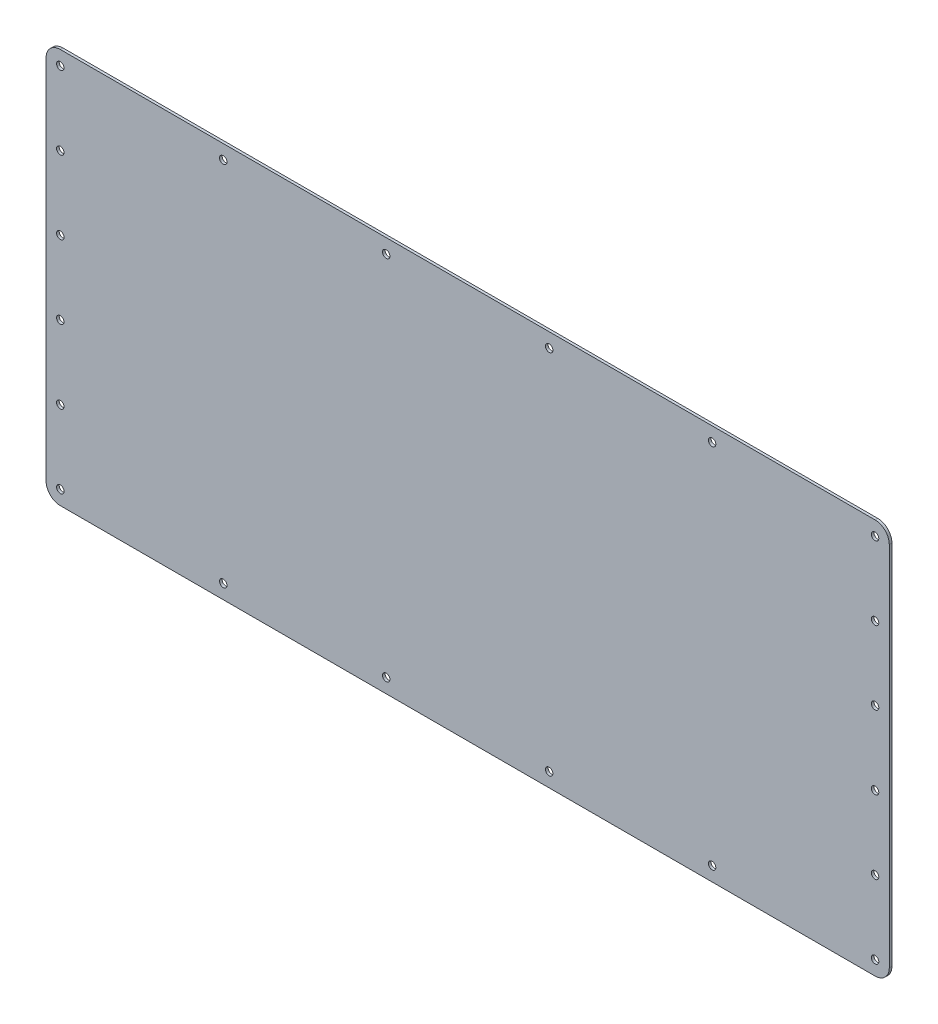
ISO-10303-21;
HEADER;
FILE_DESCRIPTION(('STEP AP214'),'2;1');
FILE_NAME('part.step','',(''),(''),'','','');
FILE_SCHEMA(('AUTOMOTIVE_DESIGN { 1 0 10303 214 1 1 1 1 }'));
ENDSEC;
DATA;
#1=APPLICATION_CONTEXT('core data for automotive mechanical design processes');
#2=APPLICATION_PROTOCOL_DEFINITION('international standard','automotive_design',2000,#1);
#3=PRODUCT_CONTEXT('',#1,'mechanical');
#4=PRODUCT('Part','Part','',(#3));
#5=PRODUCT_RELATED_PRODUCT_CATEGORY('part','',(#4));
#6=PRODUCT_DEFINITION_FORMATION('','',#4);
#7=PRODUCT_DEFINITION_CONTEXT('part definition',#1,'design');
#8=PRODUCT_DEFINITION('design','',#6,#7);
#9=PRODUCT_DEFINITION_SHAPE('','',#8);
#10=(LENGTH_UNIT() NAMED_UNIT(*) SI_UNIT(.MILLI.,.METRE.));
#11=(NAMED_UNIT(*) PLANE_ANGLE_UNIT() SI_UNIT($,.RADIAN.));
#12=(NAMED_UNIT(*) SI_UNIT($,.STERADIAN.) SOLID_ANGLE_UNIT());
#13=UNCERTAINTY_MEASURE_WITH_UNIT(LENGTH_MEASURE(1.E-05),#10,'distance_accuracy_value','');
#14=(GEOMETRIC_REPRESENTATION_CONTEXT(3) GLOBAL_UNCERTAINTY_ASSIGNED_CONTEXT((#13)) GLOBAL_UNIT_ASSIGNED_CONTEXT((#10,
#11,#12)) REPRESENTATION_CONTEXT('',''));
#15=CARTESIAN_POINT('',(0.,0.,0.));
#16=DIRECTION('',(0.,0.,1.));
#17=DIRECTION('',(1.,0.,0.));
#18=AXIS2_PLACEMENT_3D('',#15,#16,#17);
#19=CARTESIAN_POINT('',(282.342840444,132.289198083,1.76784));
#20=DIRECTION('',(-1.,0.,0.));
#21=DIRECTION('',(0.,-1.,0.));
#22=AXIS2_PLACEMENT_3D('',#19,#20,#21);
#23=PLANE('',#22);
#24=DIRECTION('',(0.,1.,0.));
#25=VECTOR('',#24,1.);
#26=CARTESIAN_POINT('',(282.342840444,132.289198083,0.));
#27=LINE('',#26,#25);
#28=CARTESIAN_POINT('',(282.342840444,-122.764198083,0.));
#29=VERTEX_POINT('',#28);
#30=CARTESIAN_POINT('',(282.342840444,122.764198083,0.));
#31=VERTEX_POINT('',#30);
#32=EDGE_CURVE('E128',#29,#31,#27,.T.);
#33=ORIENTED_EDGE('',*,*,#32,.T.);
#34=DIRECTION('',(0.,0.,-1.));
#35=VECTOR('',#34,1.);
#36=CARTESIAN_POINT('',(282.342840444,122.764198083,1.76784));
#37=LINE('',#36,#35);
#38=CARTESIAN_POINT('',(282.342840444,122.764198083,1.76784));
#39=VERTEX_POINT('',#38);
#40=EDGE_CURVE('E151',#31,#39,#37,.F.);
#41=ORIENTED_EDGE('',*,*,#40,.T.);
#42=DIRECTION('',(0.,1.,0.));
#43=VECTOR('',#42,1.);
#44=CARTESIAN_POINT('',(282.342840444,132.289198083,1.76784));
#45=LINE('',#44,#43);
#46=CARTESIAN_POINT('',(282.342840444,-122.764198083,1.76784));
#47=VERTEX_POINT('',#46);
#48=EDGE_CURVE('E126',#47,#39,#45,.T.);
#49=ORIENTED_EDGE('',*,*,#48,.F.);
#50=DIRECTION('',(0.,0.,-1.));
#51=VECTOR('',#50,1.);
#52=CARTESIAN_POINT('',(282.342840444,-122.764198083,1.76784));
#53=LINE('',#52,#51);
#54=EDGE_CURVE('E148',#47,#29,#53,.T.);
#55=ORIENTED_EDGE('',*,*,#54,.T.);
#56=EDGE_LOOP('',(#33,#41,#49,#55));
#57=FACE_BOUND('',#56,.T.);
#58=ADVANCED_FACE('F33',(#57),#23,.F.);
#59=CARTESIAN_POINT('',(-282.342840444,132.289198083,1.76784));
#60=DIRECTION('',(0.,-1.,0.));
#61=DIRECTION('',(0.,0.,-1.));
#62=AXIS2_PLACEMENT_3D('',#59,#60,#61);
#63=PLANE('',#62);
#64=DIRECTION('',(-1.,0.,0.));
#65=VECTOR('',#64,1.);
#66=CARTESIAN_POINT('',(-282.342840444,132.289198083,0.));
#67=LINE('',#66,#65);
#68=CARTESIAN_POINT('',(272.817840444,132.289198083,0.));
#69=VERTEX_POINT('',#68);
#70=CARTESIAN_POINT('',(-272.817840444,132.289198083,0.));
#71=VERTEX_POINT('',#70);
#72=EDGE_CURVE('E124',#69,#71,#67,.T.);
#73=ORIENTED_EDGE('',*,*,#72,.T.);
#74=DIRECTION('',(0.,0.,-1.));
#75=VECTOR('',#74,1.);
#76=CARTESIAN_POINT('',(-272.817840444,132.289198083,1.76784));
#77=LINE('',#76,#75);
#78=CARTESIAN_POINT('',(-272.817840444,132.289198083,1.76784));
#79=VERTEX_POINT('',#78);
#80=EDGE_CURVE('E103',#71,#79,#77,.F.);
#81=ORIENTED_EDGE('',*,*,#80,.T.);
#82=DIRECTION('',(-1.,0.,0.));
#83=VECTOR('',#82,1.);
#84=CARTESIAN_POINT('',(-282.342840444,132.289198083,1.76784));
#85=LINE('',#84,#83);
#86=CARTESIAN_POINT('',(272.817840444,132.289198083,1.76784));
#87=VERTEX_POINT('',#86);
#88=EDGE_CURVE('E167',#87,#79,#85,.T.);
#89=ORIENTED_EDGE('',*,*,#88,.F.);
#90=DIRECTION('',(0.,0.,-1.));
#91=VECTOR('',#90,1.);
#92=CARTESIAN_POINT('',(272.817840444,132.289198083,1.76784));
#93=LINE('',#92,#91);
#94=EDGE_CURVE('E108',#87,#69,#93,.T.);
#95=ORIENTED_EDGE('',*,*,#94,.T.);
#96=EDGE_LOOP('',(#73,#81,#89,#95));
#97=FACE_BOUND('',#96,.T.);
#98=ADVANCED_FACE('F344',(#97),#63,.F.);
#99=CARTESIAN_POINT('',(-282.342840444,132.289198083,1.76784));
#100=DIRECTION('',(1.,0.,0.));
#101=DIRECTION('',(0.,1.,0.));
#102=AXIS2_PLACEMENT_3D('',#99,#100,#101);
#103=PLANE('',#102);
#104=DIRECTION('',(0.,-1.,0.));
#105=VECTOR('',#104,1.);
#106=CARTESIAN_POINT('',(-282.342840444,132.289198083,1.76784));
#107=LINE('',#106,#105);
#108=CARTESIAN_POINT('',(-282.342840444,122.764198083,1.76784));
#109=VERTEX_POINT('',#108);
#110=CARTESIAN_POINT('',(-282.342840444,-122.764198083,1.76784));
#111=VERTEX_POINT('',#110);
#112=EDGE_CURVE('E117',#109,#111,#107,.T.);
#113=ORIENTED_EDGE('',*,*,#112,.F.);
#114=DIRECTION('',(0.,0.,-1.));
#115=VECTOR('',#114,1.);
#116=CARTESIAN_POINT('',(-282.342840444,122.764198083,1.76784));
#117=LINE('',#116,#115);
#118=CARTESIAN_POINT('',(-282.342840444,122.764198083,0.));
#119=VERTEX_POINT('',#118);
#120=EDGE_CURVE('E102',#109,#119,#117,.T.);
#121=ORIENTED_EDGE('',*,*,#120,.T.);
#122=DIRECTION('',(0.,-1.,0.));
#123=VECTOR('',#122,1.);
#124=CARTESIAN_POINT('',(-282.342840444,132.289198083,0.));
#125=LINE('',#124,#123);
#126=CARTESIAN_POINT('',(-282.342840444,-122.764198083,0.));
#127=VERTEX_POINT('',#126);
#128=EDGE_CURVE('E115',#119,#127,#125,.T.);
#129=ORIENTED_EDGE('',*,*,#128,.T.);
#130=DIRECTION('',(0.,0.,-1.));
#131=VECTOR('',#130,1.);
#132=CARTESIAN_POINT('',(-282.342840444,-122.764198083,1.76784));
#133=LINE('',#132,#131);
#134=EDGE_CURVE('E119',#127,#111,#133,.F.);
#135=ORIENTED_EDGE('',*,*,#134,.T.);
#136=EDGE_LOOP('',(#113,#121,#129,#135));
#137=FACE_BOUND('',#136,.T.);
#138=ADVANCED_FACE('F114',(#137),#103,.F.);
#139=CARTESIAN_POINT('',(-282.342840444,-132.289198083,1.76784));
#140=DIRECTION('',(0.,1.,0.));
#141=DIRECTION('',(0.,0.,1.));
#142=AXIS2_PLACEMENT_3D('',#139,#140,#141);
#143=PLANE('',#142);
#144=DIRECTION('',(1.,0.,0.));
#145=VECTOR('',#144,1.);
#146=CARTESIAN_POINT('',(-282.342840444,-132.289198083,0.));
#147=LINE('',#146,#145);
#148=CARTESIAN_POINT('',(-272.817840444,-132.289198083,0.));
#149=VERTEX_POINT('',#148);
#150=CARTESIAN_POINT('',(272.817840444,-132.289198083,0.));
#151=VERTEX_POINT('',#150);
#152=EDGE_CURVE('E123',#149,#151,#147,.T.);
#153=ORIENTED_EDGE('',*,*,#152,.T.);
#154=DIRECTION('',(0.,0.,-1.));
#155=VECTOR('',#154,1.);
#156=CARTESIAN_POINT('',(272.817840444,-132.289198083,1.76784));
#157=LINE('',#156,#155);
#158=CARTESIAN_POINT('',(272.817840444,-132.289198083,1.76784));
#159=VERTEX_POINT('',#158);
#160=EDGE_CURVE('E11',#151,#159,#157,.F.);
#161=ORIENTED_EDGE('',*,*,#160,.T.);
#162=DIRECTION('',(1.,0.,0.));
#163=VECTOR('',#162,1.);
#164=CARTESIAN_POINT('',(-282.342840444,-132.289198083,1.76784));
#165=LINE('',#164,#163);
#166=CARTESIAN_POINT('',(-272.817840444,-132.289198083,1.76784));
#167=VERTEX_POINT('',#166);
#168=EDGE_CURVE('E132',#167,#159,#165,.T.);
#169=ORIENTED_EDGE('',*,*,#168,.F.);
#170=DIRECTION('',(0.,0.,-1.));
#171=VECTOR('',#170,1.);
#172=CARTESIAN_POINT('',(-272.817840444,-132.289198083,1.76784));
#173=LINE('',#172,#171);
#174=EDGE_CURVE('E41',#167,#149,#173,.T.);
#175=ORIENTED_EDGE('',*,*,#174,.T.);
#176=EDGE_LOOP('',(#153,#161,#169,#175));
#177=FACE_BOUND('',#176,.T.);
#178=ADVANCED_FACE('F154',(#177),#143,.F.);
#179=CARTESIAN_POINT('',(0.,0.,1.76784));
#180=DIRECTION('',(0.,0.,1.));
#181=DIRECTION('',(1.,0.,0.));
#182=AXIS2_PLACEMENT_3D('',#179,#180,#181);
#183=PLANE('',#182);
#184=CARTESIAN_POINT('',(272.817840444,-122.764198083,1.76784));
#185=DIRECTION('',(0.,0.,1.));
#186=DIRECTION('',(1.,0.,0.));
#187=AXIS2_PLACEMENT_3D('',#184,#185,#186);
#188=CIRCLE('',#187,2.48919999999997);
#189=CARTESIAN_POINT('',(275.307040444,-122.764198083,1.76784));
#190=VERTEX_POINT('',#189);
#191=EDGE_CURVE('E295',#190,#190,#188,.T.);
#192=ORIENTED_EDGE('',*,*,#191,.F.);
#193=EDGE_LOOP('',(#192));
#194=FACE_BOUND('',#193,.T.);
#195=CARTESIAN_POINT('',(272.817840444,-73.6585188498,1.76784));
#196=DIRECTION('',(0.,0.,1.));
#197=DIRECTION('',(1.,0.,0.));
#198=AXIS2_PLACEMENT_3D('',#195,#196,#197);
#199=CIRCLE('',#198,2.48919999999997);
#200=CARTESIAN_POINT('',(275.307040444,-73.6585188498,1.76784));
#201=VERTEX_POINT('',#200);
#202=EDGE_CURVE('E289',#201,#201,#199,.T.);
#203=ORIENTED_EDGE('',*,*,#202,.F.);
#204=EDGE_LOOP('',(#203));
#205=FACE_BOUND('',#204,.T.);
#206=CARTESIAN_POINT('',(272.817840444,-24.5528396166,1.76784));
#207=DIRECTION('',(0.,0.,1.));
#208=DIRECTION('',(1.,0.,0.));
#209=AXIS2_PLACEMENT_3D('',#206,#207,#208);
#210=CIRCLE('',#209,2.48919999999997);
#211=CARTESIAN_POINT('',(275.307040444,-24.5528396166,1.76784));
#212=VERTEX_POINT('',#211);
#213=EDGE_CURVE('E283',#212,#212,#210,.T.);
#214=ORIENTED_EDGE('',*,*,#213,.F.);
#215=EDGE_LOOP('',(#214));
#216=FACE_BOUND('',#215,.T.);
#217=CARTESIAN_POINT('',(272.817840444,24.5528396166,1.76784));
#218=DIRECTION('',(0.,0.,1.));
#219=DIRECTION('',(1.,0.,0.));
#220=AXIS2_PLACEMENT_3D('',#217,#218,#219);
#221=CIRCLE('',#220,2.48919999999997);
#222=CARTESIAN_POINT('',(275.307040444,24.5528396166,1.76784));
#223=VERTEX_POINT('',#222);
#224=EDGE_CURVE('E277',#223,#223,#221,.T.);
#225=ORIENTED_EDGE('',*,*,#224,.F.);
#226=EDGE_LOOP('',(#225));
#227=FACE_BOUND('',#226,.T.);
#228=CARTESIAN_POINT('',(272.817840444,73.6585188498,1.76784));
#229=DIRECTION('',(0.,0.,1.));
#230=DIRECTION('',(1.,0.,0.));
#231=AXIS2_PLACEMENT_3D('',#228,#229,#230);
#232=CIRCLE('',#231,2.48919999999997);
#233=CARTESIAN_POINT('',(275.307040444,73.6585188498,1.76784));
#234=VERTEX_POINT('',#233);
#235=EDGE_CURVE('E271',#234,#234,#232,.T.);
#236=ORIENTED_EDGE('',*,*,#235,.F.);
#237=EDGE_LOOP('',(#236));
#238=FACE_BOUND('',#237,.T.);
#239=CARTESIAN_POINT('',(272.817840444,122.764198083,1.76784));
#240=DIRECTION('',(0.,0.,1.));
#241=DIRECTION('',(1.,0.,0.));
#242=AXIS2_PLACEMENT_3D('',#239,#240,#241);
#243=CIRCLE('',#242,2.48919999999997);
#244=CARTESIAN_POINT('',(275.307040444,122.764198083,1.76784));
#245=VERTEX_POINT('',#244);
#246=EDGE_CURVE('E265',#245,#245,#243,.T.);
#247=ORIENTED_EDGE('',*,*,#246,.F.);
#248=EDGE_LOOP('',(#247));
#249=FACE_BOUND('',#248,.T.);
#250=CARTESIAN_POINT('',(163.6907042664,122.764198083,1.76784));
#251=DIRECTION('',(0.,0.,1.));
#252=DIRECTION('',(1.,0.,0.));
#253=AXIS2_PLACEMENT_3D('',#250,#251,#252);
#254=CIRCLE('',#253,2.4892);
#255=CARTESIAN_POINT('',(166.1799042664,122.764198083,1.76784));
#256=VERTEX_POINT('',#255);
#257=EDGE_CURVE('E259',#256,#256,#254,.T.);
#258=ORIENTED_EDGE('',*,*,#257,.F.);
#259=EDGE_LOOP('',(#258));
#260=FACE_BOUND('',#259,.T.);
#261=CARTESIAN_POINT('',(54.5635680888,122.764198083,1.76784));
#262=DIRECTION('',(0.,0.,1.));
#263=DIRECTION('',(1.,0.,0.));
#264=AXIS2_PLACEMENT_3D('',#261,#262,#263);
#265=CIRCLE('',#264,2.48919999999999);
#266=CARTESIAN_POINT('',(57.0527680888,122.764198083,1.76784));
#267=VERTEX_POINT('',#266);
#268=EDGE_CURVE('E253',#267,#267,#265,.T.);
#269=ORIENTED_EDGE('',*,*,#268,.F.);
#270=EDGE_LOOP('',(#269));
#271=FACE_BOUND('',#270,.T.);
#272=CARTESIAN_POINT('',(54.5635680888,-122.764198083,1.76784));
#273=DIRECTION('',(0.,0.,1.));
#274=DIRECTION('',(1.,0.,0.));
#275=AXIS2_PLACEMENT_3D('',#272,#273,#274);
#276=CIRCLE('',#275,2.48919999999999);
#277=CARTESIAN_POINT('',(57.0527680888,-122.764198083,1.76784));
#278=VERTEX_POINT('',#277);
#279=EDGE_CURVE('E247',#278,#278,#276,.T.);
#280=ORIENTED_EDGE('',*,*,#279,.F.);
#281=EDGE_LOOP('',(#280));
#282=FACE_BOUND('',#281,.T.);
#283=CARTESIAN_POINT('',(163.6907042664,-122.764198083,1.76784));
#284=DIRECTION('',(0.,0.,1.));
#285=DIRECTION('',(1.,0.,0.));
#286=AXIS2_PLACEMENT_3D('',#283,#284,#285);
#287=CIRCLE('',#286,2.4892);
#288=CARTESIAN_POINT('',(166.1799042664,-122.764198083,1.76784));
#289=VERTEX_POINT('',#288);
#290=EDGE_CURVE('E241',#289,#289,#287,.T.);
#291=ORIENTED_EDGE('',*,*,#290,.F.);
#292=EDGE_LOOP('',(#291));
#293=FACE_BOUND('',#292,.T.);
#294=CARTESIAN_POINT('',(-272.817840444,-122.764198083,1.76784));
#295=DIRECTION('',(0.,0.,1.));
#296=DIRECTION('',(1.,0.,0.));
#297=AXIS2_PLACEMENT_3D('',#294,#295,#296);
#298=CIRCLE('',#297,2.48919999999997);
#299=CARTESIAN_POINT('',(-270.328640444,-122.764198083,1.76784));
#300=VERTEX_POINT('',#299);
#301=EDGE_CURVE('E235',#300,#300,#298,.T.);
#302=ORIENTED_EDGE('',*,*,#301,.F.);
#303=EDGE_LOOP('',(#302));
#304=FACE_BOUND('',#303,.T.);
#305=CARTESIAN_POINT('',(-272.817840444,-73.6585188498,1.76784));
#306=DIRECTION('',(0.,0.,1.));
#307=DIRECTION('',(1.,0.,0.));
#308=AXIS2_PLACEMENT_3D('',#305,#306,#307);
#309=CIRCLE('',#308,2.48919999999997);
#310=CARTESIAN_POINT('',(-270.328640444,-73.6585188498,1.76784));
#311=VERTEX_POINT('',#310);
#312=EDGE_CURVE('E229',#311,#311,#309,.T.);
#313=ORIENTED_EDGE('',*,*,#312,.F.);
#314=EDGE_LOOP('',(#313));
#315=FACE_BOUND('',#314,.T.);
#316=CARTESIAN_POINT('',(-272.817840444,-24.5528396166,1.76784));
#317=DIRECTION('',(0.,0.,1.));
#318=DIRECTION('',(1.,0.,0.));
#319=AXIS2_PLACEMENT_3D('',#316,#317,#318);
#320=CIRCLE('',#319,2.48919999999997);
#321=CARTESIAN_POINT('',(-270.328640444,-24.5528396166,1.76784));
#322=VERTEX_POINT('',#321);
#323=EDGE_CURVE('E223',#322,#322,#320,.T.);
#324=ORIENTED_EDGE('',*,*,#323,.F.);
#325=EDGE_LOOP('',(#324));
#326=FACE_BOUND('',#325,.T.);
#327=CARTESIAN_POINT('',(-272.817840444,24.5528396166,1.76784));
#328=DIRECTION('',(0.,0.,1.));
#329=DIRECTION('',(1.,0.,0.));
#330=AXIS2_PLACEMENT_3D('',#327,#328,#329);
#331=CIRCLE('',#330,2.48919999999997);
#332=CARTESIAN_POINT('',(-270.328640444,24.5528396166,1.76784));
#333=VERTEX_POINT('',#332);
#334=EDGE_CURVE('E217',#333,#333,#331,.T.);
#335=ORIENTED_EDGE('',*,*,#334,.F.);
#336=EDGE_LOOP('',(#335));
#337=FACE_BOUND('',#336,.T.);
#338=CARTESIAN_POINT('',(-272.817840444,73.6585188498,1.76784));
#339=DIRECTION('',(0.,0.,1.));
#340=DIRECTION('',(1.,0.,0.));
#341=AXIS2_PLACEMENT_3D('',#338,#339,#340);
#342=CIRCLE('',#341,2.48919999999997);
#343=CARTESIAN_POINT('',(-270.328640444,73.6585188498,1.76784));
#344=VERTEX_POINT('',#343);
#345=EDGE_CURVE('E211',#344,#344,#342,.T.);
#346=ORIENTED_EDGE('',*,*,#345,.F.);
#347=EDGE_LOOP('',(#346));
#348=FACE_BOUND('',#347,.T.);
#349=CARTESIAN_POINT('',(-272.817840444,122.764198083,1.76784));
#350=DIRECTION('',(0.,0.,1.));
#351=DIRECTION('',(1.,0.,0.));
#352=AXIS2_PLACEMENT_3D('',#349,#350,#351);
#353=CIRCLE('',#352,2.48919999999997);
#354=CARTESIAN_POINT('',(-270.328640444,122.764198083,1.76784));
#355=VERTEX_POINT('',#354);
#356=EDGE_CURVE('E205',#355,#355,#353,.T.);
#357=ORIENTED_EDGE('',*,*,#356,.F.);
#358=EDGE_LOOP('',(#357));
#359=FACE_BOUND('',#358,.T.);
#360=CARTESIAN_POINT('',(-163.6907042664,122.764198083,1.76784));
#361=DIRECTION('',(0.,0.,1.));
#362=DIRECTION('',(1.,0.,0.));
#363=AXIS2_PLACEMENT_3D('',#360,#361,#362);
#364=CIRCLE('',#363,2.4892);
#365=CARTESIAN_POINT('',(-161.2015042664,122.764198083,1.76784));
#366=VERTEX_POINT('',#365);
#367=EDGE_CURVE('E199',#366,#366,#364,.T.);
#368=ORIENTED_EDGE('',*,*,#367,.F.);
#369=EDGE_LOOP('',(#368));
#370=FACE_BOUND('',#369,.T.);
#371=CARTESIAN_POINT('',(-54.5635680888,122.764198083,1.76784));
#372=DIRECTION('',(0.,0.,1.));
#373=DIRECTION('',(1.,0.,0.));
#374=AXIS2_PLACEMENT_3D('',#371,#372,#373);
#375=CIRCLE('',#374,2.48919999999999);
#376=CARTESIAN_POINT('',(-52.0743680888,122.764198083,1.76784));
#377=VERTEX_POINT('',#376);
#378=EDGE_CURVE('E193',#377,#377,#375,.T.);
#379=ORIENTED_EDGE('',*,*,#378,.F.);
#380=EDGE_LOOP('',(#379));
#381=FACE_BOUND('',#380,.T.);
#382=CARTESIAN_POINT('',(-54.5635680888,-122.764198083,1.76784));
#383=DIRECTION('',(0.,0.,1.));
#384=DIRECTION('',(1.,0.,0.));
#385=AXIS2_PLACEMENT_3D('',#382,#383,#384);
#386=CIRCLE('',#385,2.48919999999999);
#387=CARTESIAN_POINT('',(-52.0743680888,-122.764198083,1.76784));
#388=VERTEX_POINT('',#387);
#389=EDGE_CURVE('E185',#388,#388,#386,.T.);
#390=ORIENTED_EDGE('',*,*,#389,.F.);
#391=EDGE_LOOP('',(#390));
#392=FACE_BOUND('',#391,.T.);
#393=CARTESIAN_POINT('',(-163.6907042664,-122.764198083,1.76784));
#394=DIRECTION('',(0.,0.,1.));
#395=DIRECTION('',(1.,0.,0.));
#396=AXIS2_PLACEMENT_3D('',#393,#394,#395);
#397=CIRCLE('',#396,2.4892);
#398=CARTESIAN_POINT('',(-161.2015042664,-122.764198083,1.76784));
#399=VERTEX_POINT('',#398);
#400=EDGE_CURVE('E177',#399,#399,#397,.T.);
#401=ORIENTED_EDGE('',*,*,#400,.F.);
#402=EDGE_LOOP('',(#401));
#403=FACE_BOUND('',#402,.T.);
#404=ORIENTED_EDGE('',*,*,#88,.T.);
#405=CARTESIAN_POINT('',(-272.817840444,122.764198083,1.76784));
#406=DIRECTION('',(0.,0.,1.));
#407=DIRECTION('',(1.,0.,0.));
#408=AXIS2_PLACEMENT_3D('',#405,#406,#407);
#409=CIRCLE('',#408,9.525);
#410=EDGE_CURVE('E146',#79,#109,#409,.T.);
#411=ORIENTED_EDGE('',*,*,#410,.T.);
#412=ORIENTED_EDGE('',*,*,#112,.T.);
#413=CARTESIAN_POINT('',(-272.817840444,-122.764198083,1.76784));
#414=DIRECTION('',(0.,0.,1.));
#415=DIRECTION('',(1.,0.,0.));
#416=AXIS2_PLACEMENT_3D('',#413,#414,#415);
#417=CIRCLE('',#416,9.525);
#418=EDGE_CURVE('E53',#111,#167,#417,.T.);
#419=ORIENTED_EDGE('',*,*,#418,.T.);
#420=ORIENTED_EDGE('',*,*,#168,.T.);
#421=CARTESIAN_POINT('',(272.817840444,-122.764198083,1.76784));
#422=DIRECTION('',(0.,0.,1.));
#423=DIRECTION('',(1.,0.,0.));
#424=AXIS2_PLACEMENT_3D('',#421,#422,#423);
#425=CIRCLE('',#424,9.525);
#426=EDGE_CURVE('E142',#159,#47,#425,.T.);
#427=ORIENTED_EDGE('',*,*,#426,.T.);
#428=ORIENTED_EDGE('',*,*,#48,.T.);
#429=CARTESIAN_POINT('',(272.817840444,122.764198083,1.76784));
#430=DIRECTION('',(0.,0.,1.));
#431=DIRECTION('',(1.,0.,0.));
#432=AXIS2_PLACEMENT_3D('',#429,#430,#431);
#433=CIRCLE('',#432,9.525);
#434=EDGE_CURVE('E144',#39,#87,#433,.T.);
#435=ORIENTED_EDGE('',*,*,#434,.T.);
#436=EDGE_LOOP('',(#404,#411,#412,#419,#420,#427,#428,#435));
#437=FACE_BOUND('',#436,.T.);
#438=ADVANCED_FACE('F301',(#194,#205,#216,#227,#238,#249,#260,#271,#282,#293,#304,#315,#326,
#337,#348,#359,#370,#381,#392,#403,#437),#183,.T.);
#439=CARTESIAN_POINT('',(0.,0.,0.));
#440=DIRECTION('',(0.,0.,1.));
#441=DIRECTION('',(1.,0.,0.));
#442=AXIS2_PLACEMENT_3D('',#439,#440,#441);
#443=PLANE('',#442);
#444=CARTESIAN_POINT('',(272.817840444,-122.764198083,0.));
#445=DIRECTION('',(0.,0.,1.));
#446=DIRECTION('',(1.,0.,0.));
#447=AXIS2_PLACEMENT_3D('',#444,#445,#446);
#448=CIRCLE('',#447,2.4892);
#449=CARTESIAN_POINT('',(275.307040444,-122.764198083,0.));
#450=VERTEX_POINT('',#449);
#451=EDGE_CURVE('E292',#450,#450,#448,.T.);
#452=ORIENTED_EDGE('',*,*,#451,.T.);
#453=EDGE_LOOP('',(#452));
#454=FACE_BOUND('',#453,.T.);
#455=CARTESIAN_POINT('',(272.817840444,-73.6585188498,0.));
#456=DIRECTION('',(0.,0.,1.));
#457=DIRECTION('',(1.,0.,0.));
#458=AXIS2_PLACEMENT_3D('',#455,#456,#457);
#459=CIRCLE('',#458,2.4892);
#460=CARTESIAN_POINT('',(275.307040444,-73.6585188498,0.));
#461=VERTEX_POINT('',#460);
#462=EDGE_CURVE('E286',#461,#461,#459,.T.);
#463=ORIENTED_EDGE('',*,*,#462,.T.);
#464=EDGE_LOOP('',(#463));
#465=FACE_BOUND('',#464,.T.);
#466=CARTESIAN_POINT('',(272.817840444,-24.5528396166,0.));
#467=DIRECTION('',(0.,0.,1.));
#468=DIRECTION('',(1.,0.,0.));
#469=AXIS2_PLACEMENT_3D('',#466,#467,#468);
#470=CIRCLE('',#469,2.4892);
#471=CARTESIAN_POINT('',(275.307040444,-24.5528396166,0.));
#472=VERTEX_POINT('',#471);
#473=EDGE_CURVE('E280',#472,#472,#470,.T.);
#474=ORIENTED_EDGE('',*,*,#473,.T.);
#475=EDGE_LOOP('',(#474));
#476=FACE_BOUND('',#475,.T.);
#477=CARTESIAN_POINT('',(272.817840444,24.5528396166,0.));
#478=DIRECTION('',(0.,0.,1.));
#479=DIRECTION('',(1.,0.,0.));
#480=AXIS2_PLACEMENT_3D('',#477,#478,#479);
#481=CIRCLE('',#480,2.4892);
#482=CARTESIAN_POINT('',(275.307040444,24.5528396166,0.));
#483=VERTEX_POINT('',#482);
#484=EDGE_CURVE('E274',#483,#483,#481,.T.);
#485=ORIENTED_EDGE('',*,*,#484,.T.);
#486=EDGE_LOOP('',(#485));
#487=FACE_BOUND('',#486,.T.);
#488=CARTESIAN_POINT('',(272.817840444,73.6585188498,0.));
#489=DIRECTION('',(0.,0.,1.));
#490=DIRECTION('',(1.,0.,0.));
#491=AXIS2_PLACEMENT_3D('',#488,#489,#490);
#492=CIRCLE('',#491,2.4892);
#493=CARTESIAN_POINT('',(275.307040444,73.6585188498,0.));
#494=VERTEX_POINT('',#493);
#495=EDGE_CURVE('E268',#494,#494,#492,.T.);
#496=ORIENTED_EDGE('',*,*,#495,.T.);
#497=EDGE_LOOP('',(#496));
#498=FACE_BOUND('',#497,.T.);
#499=CARTESIAN_POINT('',(272.817840444,122.764198083,0.));
#500=DIRECTION('',(0.,0.,1.));
#501=DIRECTION('',(1.,0.,0.));
#502=AXIS2_PLACEMENT_3D('',#499,#500,#501);
#503=CIRCLE('',#502,2.4892);
#504=CARTESIAN_POINT('',(275.307040444,122.764198083,0.));
#505=VERTEX_POINT('',#504);
#506=EDGE_CURVE('E262',#505,#505,#503,.T.);
#507=ORIENTED_EDGE('',*,*,#506,.T.);
#508=EDGE_LOOP('',(#507));
#509=FACE_BOUND('',#508,.T.);
#510=CARTESIAN_POINT('',(163.6907042664,122.764198083,0.));
#511=DIRECTION('',(0.,0.,1.));
#512=DIRECTION('',(1.,0.,0.));
#513=AXIS2_PLACEMENT_3D('',#510,#511,#512);
#514=CIRCLE('',#513,2.4892);
#515=CARTESIAN_POINT('',(166.1799042664,122.764198083,0.));
#516=VERTEX_POINT('',#515);
#517=EDGE_CURVE('E256',#516,#516,#514,.T.);
#518=ORIENTED_EDGE('',*,*,#517,.T.);
#519=EDGE_LOOP('',(#518));
#520=FACE_BOUND('',#519,.T.);
#521=CARTESIAN_POINT('',(54.5635680888,122.764198083,0.));
#522=DIRECTION('',(0.,0.,1.));
#523=DIRECTION('',(1.,0.,0.));
#524=AXIS2_PLACEMENT_3D('',#521,#522,#523);
#525=CIRCLE('',#524,2.48919999999999);
#526=CARTESIAN_POINT('',(57.0527680888,122.764198083,0.));
#527=VERTEX_POINT('',#526);
#528=EDGE_CURVE('E250',#527,#527,#525,.T.);
#529=ORIENTED_EDGE('',*,*,#528,.T.);
#530=EDGE_LOOP('',(#529));
#531=FACE_BOUND('',#530,.T.);
#532=CARTESIAN_POINT('',(54.5635680888,-122.764198083,0.));
#533=DIRECTION('',(0.,0.,1.));
#534=DIRECTION('',(1.,0.,0.));
#535=AXIS2_PLACEMENT_3D('',#532,#533,#534);
#536=CIRCLE('',#535,2.48919999999999);
#537=CARTESIAN_POINT('',(57.0527680888,-122.764198083,0.));
#538=VERTEX_POINT('',#537);
#539=EDGE_CURVE('E244',#538,#538,#536,.T.);
#540=ORIENTED_EDGE('',*,*,#539,.T.);
#541=EDGE_LOOP('',(#540));
#542=FACE_BOUND('',#541,.T.);
#543=CARTESIAN_POINT('',(163.6907042664,-122.764198083,0.));
#544=DIRECTION('',(0.,0.,1.));
#545=DIRECTION('',(1.,0.,0.));
#546=AXIS2_PLACEMENT_3D('',#543,#544,#545);
#547=CIRCLE('',#546,2.4892);
#548=CARTESIAN_POINT('',(166.1799042664,-122.764198083,0.));
#549=VERTEX_POINT('',#548);
#550=EDGE_CURVE('E238',#549,#549,#547,.T.);
#551=ORIENTED_EDGE('',*,*,#550,.T.);
#552=EDGE_LOOP('',(#551));
#553=FACE_BOUND('',#552,.T.);
#554=CARTESIAN_POINT('',(-272.817840444,-122.764198083,0.));
#555=DIRECTION('',(0.,0.,1.));
#556=DIRECTION('',(1.,0.,0.));
#557=AXIS2_PLACEMENT_3D('',#554,#555,#556);
#558=CIRCLE('',#557,2.4892);
#559=CARTESIAN_POINT('',(-270.328640444,-122.764198083,0.));
#560=VERTEX_POINT('',#559);
#561=EDGE_CURVE('E232',#560,#560,#558,.T.);
#562=ORIENTED_EDGE('',*,*,#561,.T.);
#563=EDGE_LOOP('',(#562));
#564=FACE_BOUND('',#563,.T.);
#565=CARTESIAN_POINT('',(-272.817840444,-73.6585188498,0.));
#566=DIRECTION('',(0.,0.,1.));
#567=DIRECTION('',(1.,0.,0.));
#568=AXIS2_PLACEMENT_3D('',#565,#566,#567);
#569=CIRCLE('',#568,2.4892);
#570=CARTESIAN_POINT('',(-270.328640444,-73.6585188498,0.));
#571=VERTEX_POINT('',#570);
#572=EDGE_CURVE('E226',#571,#571,#569,.T.);
#573=ORIENTED_EDGE('',*,*,#572,.T.);
#574=EDGE_LOOP('',(#573));
#575=FACE_BOUND('',#574,.T.);
#576=CARTESIAN_POINT('',(-272.817840444,-24.5528396166,0.));
#577=DIRECTION('',(0.,0.,1.));
#578=DIRECTION('',(1.,0.,0.));
#579=AXIS2_PLACEMENT_3D('',#576,#577,#578);
#580=CIRCLE('',#579,2.4892);
#581=CARTESIAN_POINT('',(-270.328640444,-24.5528396166,0.));
#582=VERTEX_POINT('',#581);
#583=EDGE_CURVE('E220',#582,#582,#580,.T.);
#584=ORIENTED_EDGE('',*,*,#583,.T.);
#585=EDGE_LOOP('',(#584));
#586=FACE_BOUND('',#585,.T.);
#587=CARTESIAN_POINT('',(-272.817840444,24.5528396166,0.));
#588=DIRECTION('',(0.,0.,1.));
#589=DIRECTION('',(1.,0.,0.));
#590=AXIS2_PLACEMENT_3D('',#587,#588,#589);
#591=CIRCLE('',#590,2.4892);
#592=CARTESIAN_POINT('',(-270.328640444,24.5528396166,0.));
#593=VERTEX_POINT('',#592);
#594=EDGE_CURVE('E214',#593,#593,#591,.T.);
#595=ORIENTED_EDGE('',*,*,#594,.T.);
#596=EDGE_LOOP('',(#595));
#597=FACE_BOUND('',#596,.T.);
#598=CARTESIAN_POINT('',(-272.817840444,73.6585188498,0.));
#599=DIRECTION('',(0.,0.,1.));
#600=DIRECTION('',(1.,0.,0.));
#601=AXIS2_PLACEMENT_3D('',#598,#599,#600);
#602=CIRCLE('',#601,2.4892);
#603=CARTESIAN_POINT('',(-270.328640444,73.6585188498,0.));
#604=VERTEX_POINT('',#603);
#605=EDGE_CURVE('E208',#604,#604,#602,.T.);
#606=ORIENTED_EDGE('',*,*,#605,.T.);
#607=EDGE_LOOP('',(#606));
#608=FACE_BOUND('',#607,.T.);
#609=CARTESIAN_POINT('',(-272.817840444,122.764198083,0.));
#610=DIRECTION('',(0.,0.,1.));
#611=DIRECTION('',(1.,0.,0.));
#612=AXIS2_PLACEMENT_3D('',#609,#610,#611);
#613=CIRCLE('',#612,2.4892);
#614=CARTESIAN_POINT('',(-270.328640444,122.764198083,0.));
#615=VERTEX_POINT('',#614);
#616=EDGE_CURVE('E202',#615,#615,#613,.T.);
#617=ORIENTED_EDGE('',*,*,#616,.T.);
#618=EDGE_LOOP('',(#617));
#619=FACE_BOUND('',#618,.T.);
#620=CARTESIAN_POINT('',(-163.6907042664,122.764198083,0.));
#621=DIRECTION('',(0.,0.,1.));
#622=DIRECTION('',(1.,0.,0.));
#623=AXIS2_PLACEMENT_3D('',#620,#621,#622);
#624=CIRCLE('',#623,2.4892);
#625=CARTESIAN_POINT('',(-161.2015042664,122.764198083,0.));
#626=VERTEX_POINT('',#625);
#627=EDGE_CURVE('E196',#626,#626,#624,.T.);
#628=ORIENTED_EDGE('',*,*,#627,.T.);
#629=EDGE_LOOP('',(#628));
#630=FACE_BOUND('',#629,.T.);
#631=CARTESIAN_POINT('',(-54.5635680888,122.764198083,0.));
#632=DIRECTION('',(0.,0.,1.));
#633=DIRECTION('',(1.,0.,0.));
#634=AXIS2_PLACEMENT_3D('',#631,#632,#633);
#635=CIRCLE('',#634,2.48919999999999);
#636=CARTESIAN_POINT('',(-52.0743680888,122.764198083,0.));
#637=VERTEX_POINT('',#636);
#638=EDGE_CURVE('E190',#637,#637,#635,.T.);
#639=ORIENTED_EDGE('',*,*,#638,.T.);
#640=EDGE_LOOP('',(#639));
#641=FACE_BOUND('',#640,.T.);
#642=CARTESIAN_POINT('',(-54.5635680888,-122.764198083,0.));
#643=DIRECTION('',(0.,0.,1.));
#644=DIRECTION('',(1.,0.,0.));
#645=AXIS2_PLACEMENT_3D('',#642,#643,#644);
#646=CIRCLE('',#645,2.48919999999999);
#647=CARTESIAN_POINT('',(-52.0743680888,-122.764198083,0.));
#648=VERTEX_POINT('',#647);
#649=EDGE_CURVE('E181',#648,#648,#646,.T.);
#650=ORIENTED_EDGE('',*,*,#649,.T.);
#651=EDGE_LOOP('',(#650));
#652=FACE_BOUND('',#651,.T.);
#653=CARTESIAN_POINT('',(-163.6907042664,-122.764198083,0.));
#654=DIRECTION('',(0.,0.,1.));
#655=DIRECTION('',(1.,0.,0.));
#656=AXIS2_PLACEMENT_3D('',#653,#654,#655);
#657=CIRCLE('',#656,2.4892);
#658=CARTESIAN_POINT('',(-161.2015042664,-122.764198083,0.));
#659=VERTEX_POINT('',#658);
#660=EDGE_CURVE('E172',#659,#659,#657,.T.);
#661=ORIENTED_EDGE('',*,*,#660,.T.);
#662=EDGE_LOOP('',(#661));
#663=FACE_BOUND('',#662,.T.);
#664=ORIENTED_EDGE('',*,*,#128,.F.);
#665=CARTESIAN_POINT('',(-272.817840444,122.764198083,0.));
#666=DIRECTION('',(0.,0.,1.));
#667=DIRECTION('',(1.,0.,0.));
#668=AXIS2_PLACEMENT_3D('',#665,#666,#667);
#669=CIRCLE('',#668,9.525);
#670=EDGE_CURVE('E98',#119,#71,#669,.F.);
#671=ORIENTED_EDGE('',*,*,#670,.T.);
#672=ORIENTED_EDGE('',*,*,#72,.F.);
#673=CARTESIAN_POINT('',(272.817840444,122.764198083,0.));
#674=DIRECTION('',(0.,0.,1.));
#675=DIRECTION('',(1.,0.,0.));
#676=AXIS2_PLACEMENT_3D('',#673,#674,#675);
#677=CIRCLE('',#676,9.525);
#678=EDGE_CURVE('E109',#69,#31,#677,.F.);
#679=ORIENTED_EDGE('',*,*,#678,.T.);
#680=ORIENTED_EDGE('',*,*,#32,.F.);
#681=CARTESIAN_POINT('',(272.817840444,-122.764198083,0.));
#682=DIRECTION('',(0.,0.,1.));
#683=DIRECTION('',(1.,0.,0.));
#684=AXIS2_PLACEMENT_3D('',#681,#682,#683);
#685=CIRCLE('',#684,9.525);
#686=EDGE_CURVE('E135',#29,#151,#685,.F.);
#687=ORIENTED_EDGE('',*,*,#686,.T.);
#688=ORIENTED_EDGE('',*,*,#152,.F.);
#689=CARTESIAN_POINT('',(-272.817840444,-122.764198083,0.));
#690=DIRECTION('',(0.,0.,1.));
#691=DIRECTION('',(1.,0.,0.));
#692=AXIS2_PLACEMENT_3D('',#689,#690,#691);
#693=CIRCLE('',#692,9.525);
#694=EDGE_CURVE('E118',#149,#127,#693,.F.);
#695=ORIENTED_EDGE('',*,*,#694,.T.);
#696=EDGE_LOOP('',(#664,#671,#672,#679,#680,#687,#688,#695));
#697=FACE_BOUND('',#696,.T.);
#698=ADVANCED_FACE('F121',(#454,#465,#476,#487,#498,#509,#520,#531,#542,#553,#564,#575,#586,
#597,#608,#619,#630,#641,#652,#663,#697),#443,.F.);
#699=CARTESIAN_POINT('',(-163.6907042664,-122.764198083,1.76784));
#700=DIRECTION('',(0.,0.,1.));
#701=DIRECTION('',(1.,0.,0.));
#702=AXIS2_PLACEMENT_3D('',#699,#700,#701);
#703=CYLINDRICAL_SURFACE('',#702,2.4892);
#704=ORIENTED_EDGE('',*,*,#660,.F.);
#705=EDGE_LOOP('',(#704));
#706=FACE_BOUND('',#705,.T.);
#707=ORIENTED_EDGE('',*,*,#400,.T.);
#708=EDGE_LOOP('',(#707));
#709=FACE_BOUND('',#708,.T.);
#710=ADVANCED_FACE('F366',(#706,#709),#703,.F.);
#711=CARTESIAN_POINT('',(-54.5635680888,-122.764198083,1.76784));
#712=DIRECTION('',(0.,0.,1.));
#713=DIRECTION('',(1.,0.,0.));
#714=AXIS2_PLACEMENT_3D('',#711,#712,#713);
#715=CYLINDRICAL_SURFACE('',#714,2.48919999999999);
#716=ORIENTED_EDGE('',*,*,#649,.F.);
#717=EDGE_LOOP('',(#716));
#718=FACE_BOUND('',#717,.T.);
#719=ORIENTED_EDGE('',*,*,#389,.T.);
#720=EDGE_LOOP('',(#719));
#721=FACE_BOUND('',#720,.T.);
#722=ADVANCED_FACE('F371',(#718,#721),#715,.F.);
#723=CARTESIAN_POINT('',(-54.5635680888,122.764198083,1.76784));
#724=DIRECTION('',(0.,0.,1.));
#725=DIRECTION('',(1.,0.,0.));
#726=AXIS2_PLACEMENT_3D('',#723,#724,#725);
#727=CYLINDRICAL_SURFACE('',#726,2.48919999999999);
#728=ORIENTED_EDGE('',*,*,#638,.F.);
#729=EDGE_LOOP('',(#728));
#730=FACE_BOUND('',#729,.T.);
#731=ORIENTED_EDGE('',*,*,#378,.T.);
#732=EDGE_LOOP('',(#731));
#733=FACE_BOUND('',#732,.T.);
#734=ADVANCED_FACE('F375',(#730,#733),#727,.F.);
#735=CARTESIAN_POINT('',(-163.6907042664,122.764198083,1.76784));
#736=DIRECTION('',(0.,0.,1.));
#737=DIRECTION('',(1.,0.,0.));
#738=AXIS2_PLACEMENT_3D('',#735,#736,#737);
#739=CYLINDRICAL_SURFACE('',#738,2.4892);
#740=ORIENTED_EDGE('',*,*,#627,.F.);
#741=EDGE_LOOP('',(#740));
#742=FACE_BOUND('',#741,.T.);
#743=ORIENTED_EDGE('',*,*,#367,.T.);
#744=EDGE_LOOP('',(#743));
#745=FACE_BOUND('',#744,.T.);
#746=ADVANCED_FACE('F379',(#742,#745),#739,.F.);
#747=CARTESIAN_POINT('',(-272.817840444,122.764198083,1.76784));
#748=DIRECTION('',(0.,0.,1.));
#749=DIRECTION('',(1.,0.,0.));
#750=AXIS2_PLACEMENT_3D('',#747,#748,#749);
#751=CYLINDRICAL_SURFACE('',#750,2.4892);
#752=ORIENTED_EDGE('',*,*,#616,.F.);
#753=EDGE_LOOP('',(#752));
#754=FACE_BOUND('',#753,.T.);
#755=ORIENTED_EDGE('',*,*,#356,.T.);
#756=EDGE_LOOP('',(#755));
#757=FACE_BOUND('',#756,.T.);
#758=ADVANCED_FACE('F383',(#754,#757),#751,.F.);
#759=CARTESIAN_POINT('',(-272.817840444,73.6585188498,1.76784));
#760=DIRECTION('',(0.,0.,1.));
#761=DIRECTION('',(1.,0.,0.));
#762=AXIS2_PLACEMENT_3D('',#759,#760,#761);
#763=CYLINDRICAL_SURFACE('',#762,2.4892);
#764=ORIENTED_EDGE('',*,*,#605,.F.);
#765=EDGE_LOOP('',(#764));
#766=FACE_BOUND('',#765,.T.);
#767=ORIENTED_EDGE('',*,*,#345,.T.);
#768=EDGE_LOOP('',(#767));
#769=FACE_BOUND('',#768,.T.);
#770=ADVANCED_FACE('F387',(#766,#769),#763,.F.);
#771=CARTESIAN_POINT('',(-272.817840444,24.5528396166,1.76784));
#772=DIRECTION('',(0.,0.,1.));
#773=DIRECTION('',(1.,0.,0.));
#774=AXIS2_PLACEMENT_3D('',#771,#772,#773);
#775=CYLINDRICAL_SURFACE('',#774,2.4892);
#776=ORIENTED_EDGE('',*,*,#594,.F.);
#777=EDGE_LOOP('',(#776));
#778=FACE_BOUND('',#777,.T.);
#779=ORIENTED_EDGE('',*,*,#334,.T.);
#780=EDGE_LOOP('',(#779));
#781=FACE_BOUND('',#780,.T.);
#782=ADVANCED_FACE('F391',(#778,#781),#775,.F.);
#783=CARTESIAN_POINT('',(-272.817840444,-24.5528396166,1.76784));
#784=DIRECTION('',(0.,0.,1.));
#785=DIRECTION('',(1.,0.,0.));
#786=AXIS2_PLACEMENT_3D('',#783,#784,#785);
#787=CYLINDRICAL_SURFACE('',#786,2.4892);
#788=ORIENTED_EDGE('',*,*,#583,.F.);
#789=EDGE_LOOP('',(#788));
#790=FACE_BOUND('',#789,.T.);
#791=ORIENTED_EDGE('',*,*,#323,.T.);
#792=EDGE_LOOP('',(#791));
#793=FACE_BOUND('',#792,.T.);
#794=ADVANCED_FACE('F395',(#790,#793),#787,.F.);
#795=CARTESIAN_POINT('',(-272.817840444,-73.6585188498,1.76784));
#796=DIRECTION('',(0.,0.,1.));
#797=DIRECTION('',(1.,0.,0.));
#798=AXIS2_PLACEMENT_3D('',#795,#796,#797);
#799=CYLINDRICAL_SURFACE('',#798,2.4892);
#800=ORIENTED_EDGE('',*,*,#572,.F.);
#801=EDGE_LOOP('',(#800));
#802=FACE_BOUND('',#801,.T.);
#803=ORIENTED_EDGE('',*,*,#312,.T.);
#804=EDGE_LOOP('',(#803));
#805=FACE_BOUND('',#804,.T.);
#806=ADVANCED_FACE('F399',(#802,#805),#799,.F.);
#807=CARTESIAN_POINT('',(-272.817840444,-122.764198083,1.76784));
#808=DIRECTION('',(0.,0.,1.));
#809=DIRECTION('',(1.,0.,0.));
#810=AXIS2_PLACEMENT_3D('',#807,#808,#809);
#811=CYLINDRICAL_SURFACE('',#810,2.4892);
#812=ORIENTED_EDGE('',*,*,#561,.F.);
#813=EDGE_LOOP('',(#812));
#814=FACE_BOUND('',#813,.T.);
#815=ORIENTED_EDGE('',*,*,#301,.T.);
#816=EDGE_LOOP('',(#815));
#817=FACE_BOUND('',#816,.T.);
#818=ADVANCED_FACE('F403',(#814,#817),#811,.F.);
#819=CARTESIAN_POINT('',(163.6907042664,-122.764198083,1.76784));
#820=DIRECTION('',(0.,0.,1.));
#821=DIRECTION('',(1.,0.,0.));
#822=AXIS2_PLACEMENT_3D('',#819,#820,#821);
#823=CYLINDRICAL_SURFACE('',#822,2.4892);
#824=ORIENTED_EDGE('',*,*,#550,.F.);
#825=EDGE_LOOP('',(#824));
#826=FACE_BOUND('',#825,.T.);
#827=ORIENTED_EDGE('',*,*,#290,.T.);
#828=EDGE_LOOP('',(#827));
#829=FACE_BOUND('',#828,.T.);
#830=ADVANCED_FACE('F407',(#826,#829),#823,.F.);
#831=CARTESIAN_POINT('',(54.5635680888,-122.764198083,1.76784));
#832=DIRECTION('',(0.,0.,1.));
#833=DIRECTION('',(1.,0.,0.));
#834=AXIS2_PLACEMENT_3D('',#831,#832,#833);
#835=CYLINDRICAL_SURFACE('',#834,2.48919999999999);
#836=ORIENTED_EDGE('',*,*,#539,.F.);
#837=EDGE_LOOP('',(#836));
#838=FACE_BOUND('',#837,.T.);
#839=ORIENTED_EDGE('',*,*,#279,.T.);
#840=EDGE_LOOP('',(#839));
#841=FACE_BOUND('',#840,.T.);
#842=ADVANCED_FACE('F411',(#838,#841),#835,.F.);
#843=CARTESIAN_POINT('',(54.5635680888,122.764198083,1.76784));
#844=DIRECTION('',(0.,0.,1.));
#845=DIRECTION('',(1.,0.,0.));
#846=AXIS2_PLACEMENT_3D('',#843,#844,#845);
#847=CYLINDRICAL_SURFACE('',#846,2.48919999999999);
#848=ORIENTED_EDGE('',*,*,#528,.F.);
#849=EDGE_LOOP('',(#848));
#850=FACE_BOUND('',#849,.T.);
#851=ORIENTED_EDGE('',*,*,#268,.T.);
#852=EDGE_LOOP('',(#851));
#853=FACE_BOUND('',#852,.T.);
#854=ADVANCED_FACE('F415',(#850,#853),#847,.F.);
#855=CARTESIAN_POINT('',(163.6907042664,122.764198083,1.76784));
#856=DIRECTION('',(0.,0.,1.));
#857=DIRECTION('',(1.,0.,0.));
#858=AXIS2_PLACEMENT_3D('',#855,#856,#857);
#859=CYLINDRICAL_SURFACE('',#858,2.4892);
#860=ORIENTED_EDGE('',*,*,#517,.F.);
#861=EDGE_LOOP('',(#860));
#862=FACE_BOUND('',#861,.T.);
#863=ORIENTED_EDGE('',*,*,#257,.T.);
#864=EDGE_LOOP('',(#863));
#865=FACE_BOUND('',#864,.T.);
#866=ADVANCED_FACE('F419',(#862,#865),#859,.F.);
#867=CARTESIAN_POINT('',(272.817840444,122.764198083,1.76784));
#868=DIRECTION('',(0.,0.,1.));
#869=DIRECTION('',(1.,0.,0.));
#870=AXIS2_PLACEMENT_3D('',#867,#868,#869);
#871=CYLINDRICAL_SURFACE('',#870,2.4892);
#872=ORIENTED_EDGE('',*,*,#506,.F.);
#873=EDGE_LOOP('',(#872));
#874=FACE_BOUND('',#873,.T.);
#875=ORIENTED_EDGE('',*,*,#246,.T.);
#876=EDGE_LOOP('',(#875));
#877=FACE_BOUND('',#876,.T.);
#878=ADVANCED_FACE('F423',(#874,#877),#871,.F.);
#879=CARTESIAN_POINT('',(272.817840444,73.6585188498,1.76784));
#880=DIRECTION('',(0.,0.,1.));
#881=DIRECTION('',(1.,0.,0.));
#882=AXIS2_PLACEMENT_3D('',#879,#880,#881);
#883=CYLINDRICAL_SURFACE('',#882,2.4892);
#884=ORIENTED_EDGE('',*,*,#495,.F.);
#885=EDGE_LOOP('',(#884));
#886=FACE_BOUND('',#885,.T.);
#887=ORIENTED_EDGE('',*,*,#235,.T.);
#888=EDGE_LOOP('',(#887));
#889=FACE_BOUND('',#888,.T.);
#890=ADVANCED_FACE('F427',(#886,#889),#883,.F.);
#891=CARTESIAN_POINT('',(272.817840444,24.5528396166,1.76784));
#892=DIRECTION('',(0.,0.,1.));
#893=DIRECTION('',(1.,0.,0.));
#894=AXIS2_PLACEMENT_3D('',#891,#892,#893);
#895=CYLINDRICAL_SURFACE('',#894,2.4892);
#896=ORIENTED_EDGE('',*,*,#484,.F.);
#897=EDGE_LOOP('',(#896));
#898=FACE_BOUND('',#897,.T.);
#899=ORIENTED_EDGE('',*,*,#224,.T.);
#900=EDGE_LOOP('',(#899));
#901=FACE_BOUND('',#900,.T.);
#902=ADVANCED_FACE('F431',(#898,#901),#895,.F.);
#903=CARTESIAN_POINT('',(272.817840444,-24.5528396166,1.76784));
#904=DIRECTION('',(0.,0.,1.));
#905=DIRECTION('',(1.,0.,0.));
#906=AXIS2_PLACEMENT_3D('',#903,#904,#905);
#907=CYLINDRICAL_SURFACE('',#906,2.4892);
#908=ORIENTED_EDGE('',*,*,#473,.F.);
#909=EDGE_LOOP('',(#908));
#910=FACE_BOUND('',#909,.T.);
#911=ORIENTED_EDGE('',*,*,#213,.T.);
#912=EDGE_LOOP('',(#911));
#913=FACE_BOUND('',#912,.T.);
#914=ADVANCED_FACE('F435',(#910,#913),#907,.F.);
#915=CARTESIAN_POINT('',(272.817840444,-73.6585188498,1.76784));
#916=DIRECTION('',(0.,0.,1.));
#917=DIRECTION('',(1.,0.,0.));
#918=AXIS2_PLACEMENT_3D('',#915,#916,#917);
#919=CYLINDRICAL_SURFACE('',#918,2.4892);
#920=ORIENTED_EDGE('',*,*,#462,.F.);
#921=EDGE_LOOP('',(#920));
#922=FACE_BOUND('',#921,.T.);
#923=ORIENTED_EDGE('',*,*,#202,.T.);
#924=EDGE_LOOP('',(#923));
#925=FACE_BOUND('',#924,.T.);
#926=ADVANCED_FACE('F439',(#922,#925),#919,.F.);
#927=CARTESIAN_POINT('',(272.817840444,-122.764198083,1.76784));
#928=DIRECTION('',(0.,0.,1.));
#929=DIRECTION('',(1.,0.,0.));
#930=AXIS2_PLACEMENT_3D('',#927,#928,#929);
#931=CYLINDRICAL_SURFACE('',#930,2.4892);
#932=ORIENTED_EDGE('',*,*,#451,.F.);
#933=EDGE_LOOP('',(#932));
#934=FACE_BOUND('',#933,.T.);
#935=ORIENTED_EDGE('',*,*,#191,.T.);
#936=EDGE_LOOP('',(#935));
#937=FACE_BOUND('',#936,.T.);
#938=ADVANCED_FACE('F299',(#934,#937),#931,.F.);
#939=CARTESIAN_POINT('',(-272.817840444,122.764198083,1.76784));
#940=DIRECTION('',(0.,0.,-1.));
#941=DIRECTION('',(-1.,0.,0.));
#942=AXIS2_PLACEMENT_3D('',#939,#940,#941);
#943=CYLINDRICAL_SURFACE('',#942,9.525);
#944=ORIENTED_EDGE('',*,*,#410,.F.);
#945=ORIENTED_EDGE('',*,*,#80,.F.);
#946=ORIENTED_EDGE('',*,*,#670,.F.);
#947=ORIENTED_EDGE('',*,*,#120,.F.);
#948=EDGE_LOOP('',(#944,#945,#946,#947));
#949=FACE_BOUND('',#948,.T.);
#950=ADVANCED_FACE('F101',(#949),#943,.T.);
#951=CARTESIAN_POINT('',(272.817840444,122.764198083,1.76784));
#952=DIRECTION('',(0.,0.,-1.));
#953=DIRECTION('',(-1.,0.,0.));
#954=AXIS2_PLACEMENT_3D('',#951,#952,#953);
#955=CYLINDRICAL_SURFACE('',#954,9.525);
#956=ORIENTED_EDGE('',*,*,#434,.F.);
#957=ORIENTED_EDGE('',*,*,#40,.F.);
#958=ORIENTED_EDGE('',*,*,#678,.F.);
#959=ORIENTED_EDGE('',*,*,#94,.F.);
#960=EDGE_LOOP('',(#956,#957,#958,#959));
#961=FACE_BOUND('',#960,.T.);
#962=ADVANCED_FACE('F346',(#961),#955,.T.);
#963=CARTESIAN_POINT('',(272.817840444,-122.764198083,1.76784));
#964=DIRECTION('',(0.,0.,-1.));
#965=DIRECTION('',(-1.,0.,0.));
#966=AXIS2_PLACEMENT_3D('',#963,#964,#965);
#967=CYLINDRICAL_SURFACE('',#966,9.525);
#968=ORIENTED_EDGE('',*,*,#426,.F.);
#969=ORIENTED_EDGE('',*,*,#160,.F.);
#970=ORIENTED_EDGE('',*,*,#686,.F.);
#971=ORIENTED_EDGE('',*,*,#54,.F.);
#972=EDGE_LOOP('',(#968,#969,#970,#971));
#973=FACE_BOUND('',#972,.T.);
#974=ADVANCED_FACE('F161',(#973),#967,.T.);
#975=CARTESIAN_POINT('',(-272.817840444,-122.764198083,1.76784));
#976=DIRECTION('',(0.,0.,-1.));
#977=DIRECTION('',(-1.,0.,0.));
#978=AXIS2_PLACEMENT_3D('',#975,#976,#977);
#979=CYLINDRICAL_SURFACE('',#978,9.525);
#980=ORIENTED_EDGE('',*,*,#418,.F.);
#981=ORIENTED_EDGE('',*,*,#134,.F.);
#982=ORIENTED_EDGE('',*,*,#694,.F.);
#983=ORIENTED_EDGE('',*,*,#174,.F.);
#984=EDGE_LOOP('',(#980,#981,#982,#983));
#985=FACE_BOUND('',#984,.T.);
#986=ADVANCED_FACE('F35',(#985),#979,.T.);
#987=CLOSED_SHELL('',(#58,#98,#138,#178,#438,#698,#710,#722,#734,#746,#758,#770,#782,#794,#806,
#818,#830,#842,#854,#866,#878,#890,#902,#914,#926,#938,#950,#962,#974,#986));
#988=MANIFOLD_SOLID_BREP('B2',#987);
#989=ADVANCED_BREP_SHAPE_REPRESENTATION('',(#18,#988),#14);
#990=SHAPE_DEFINITION_REPRESENTATION(#9,#989);
ENDSEC;
END-ISO-10303-21;
